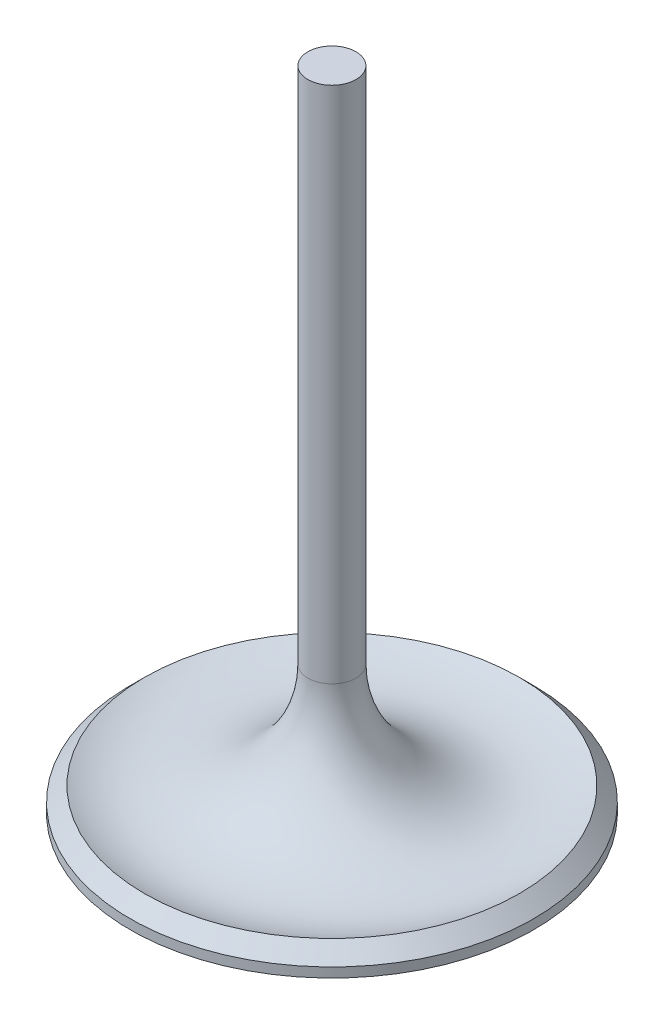
ISO-10303-21;
HEADER;
FILE_DESCRIPTION(('STEP AP214'),'2;1');
FILE_NAME('part.step','',(''),(''),'','','');
FILE_SCHEMA(('AUTOMOTIVE_DESIGN { 1 0 10303 214 1 1 1 1 }'));
ENDSEC;
DATA;
#1=APPLICATION_CONTEXT('core data for automotive mechanical design processes');
#2=APPLICATION_PROTOCOL_DEFINITION('international standard','automotive_design',2000,#1);
#3=PRODUCT_CONTEXT('',#1,'mechanical');
#4=PRODUCT('Part','Part','',(#3));
#5=PRODUCT_RELATED_PRODUCT_CATEGORY('part','',(#4));
#6=PRODUCT_DEFINITION_FORMATION('','',#4);
#7=PRODUCT_DEFINITION_CONTEXT('part definition',#1,'design');
#8=PRODUCT_DEFINITION('design','',#6,#7);
#9=PRODUCT_DEFINITION_SHAPE('','',#8);
#10=(LENGTH_UNIT() NAMED_UNIT(*) SI_UNIT(.MILLI.,.METRE.));
#11=(NAMED_UNIT(*) PLANE_ANGLE_UNIT() SI_UNIT($,.RADIAN.));
#12=(NAMED_UNIT(*) SI_UNIT($,.STERADIAN.) SOLID_ANGLE_UNIT());
#13=UNCERTAINTY_MEASURE_WITH_UNIT(LENGTH_MEASURE(1.E-05),#10,'distance_accuracy_value','');
#14=(GEOMETRIC_REPRESENTATION_CONTEXT(3) GLOBAL_UNCERTAINTY_ASSIGNED_CONTEXT((#13)) GLOBAL_UNIT_ASSIGNED_CONTEXT((#10,
#11,#12)) REPRESENTATION_CONTEXT('',''));
#15=CARTESIAN_POINT('',(0.,0.,0.));
#16=DIRECTION('',(0.,0.,1.));
#17=DIRECTION('',(1.,0.,0.));
#18=AXIS2_PLACEMENT_3D('',#15,#16,#17);
#19=CARTESIAN_POINT('',(26.67,0.,0.));
#20=DIRECTION('',(0.,-1.,0.));
#21=DIRECTION('',(0.,0.,-1.));
#22=AXIS2_PLACEMENT_3D('',#19,#20,#21);
#23=PLANE('',#22);
#24=CARTESIAN_POINT('',(0.,0.,0.));
#25=DIRECTION('',(0.,-1.,0.));
#26=DIRECTION('',(0.,0.,-1.));
#27=AXIS2_PLACEMENT_3D('',#24,#25,#26);
#28=CIRCLE('',#27,26.67);
#29=CARTESIAN_POINT('',(0.,0.,-26.67));
#30=VERTEX_POINT('',#29);
#31=EDGE_CURVE('E10',#30,#30,#28,.T.);
#32=ORIENTED_EDGE('',*,*,#31,.T.);
#33=EDGE_LOOP('',(#32));
#34=FACE_BOUND('',#33,.T.);
#35=ADVANCED_FACE('F41',(#34),#23,.T.);
#36=CARTESIAN_POINT('',(0.,0.,0.));
#37=DIRECTION('',(0.,-1.,0.));
#38=DIRECTION('',(0.,0.,-1.));
#39=AXIS2_PLACEMENT_3D('',#36,#37,#38);
#40=CYLINDRICAL_SURFACE('',#39,26.67);
#41=CARTESIAN_POINT('',(0.,1.27,0.));
#42=DIRECTION('',(0.,-1.,0.));
#43=DIRECTION('',(0.,0.,-1.));
#44=AXIS2_PLACEMENT_3D('',#41,#42,#43);
#45=CIRCLE('',#44,26.67);
#46=CARTESIAN_POINT('',(0.,1.27,-26.67));
#47=VERTEX_POINT('',#46);
#48=EDGE_CURVE('E48',#47,#47,#45,.T.);
#49=ORIENTED_EDGE('',*,*,#48,.T.);
#50=EDGE_LOOP('',(#49));
#51=FACE_BOUND('',#50,.T.);
#52=ORIENTED_EDGE('',*,*,#31,.F.);
#53=EDGE_LOOP('',(#52));
#54=FACE_BOUND('',#53,.T.);
#55=ADVANCED_FACE('F81',(#51,#54),#40,.T.);
#56=CARTESIAN_POINT('',(0.,1.27,0.));
#57=DIRECTION('',(0.,-1.,0.));
#58=DIRECTION('',(0.,0.,-1.));
#59=AXIS2_PLACEMENT_3D('',#56,#57,#58);
#60=CONICAL_SURFACE('',#59,26.67,0.785398163397458);
#61=CARTESIAN_POINT('',(0.,3.17999999999999,0.));
#62=DIRECTION('',(0.,-1.,0.));
#63=DIRECTION('',(0.,0.,-1.));
#64=AXIS2_PLACEMENT_3D('',#61,#62,#63);
#65=CIRCLE('',#64,24.76);
#66=CARTESIAN_POINT('',(0.,3.17999999999999,-24.76));
#67=VERTEX_POINT('',#66);
#68=EDGE_CURVE('E53',#67,#67,#65,.T.);
#69=ORIENTED_EDGE('',*,*,#68,.T.);
#70=EDGE_LOOP('',(#69));
#71=FACE_BOUND('',#70,.T.);
#72=ORIENTED_EDGE('',*,*,#48,.F.);
#73=EDGE_LOOP('',(#72));
#74=FACE_BOUND('',#73,.T.);
#75=ADVANCED_FACE('F85',(#71,#74),#60,.T.);
#76=CARTESIAN_POINT('',(0.,17.0542062836041,0.));
#77=DIRECTION('',(0.,-1.,0.));
#78=DIRECTION('',(0.,0.,-1.));
#79=AXIS2_PLACEMENT_3D('',#76,#77,#78);
#80=TOROIDAL_SURFACE('',#79,18.43,15.25);
#81=CARTESIAN_POINT('',(0.,17.0542062836041,0.));
#82=DIRECTION('',(0.,-1.,0.));
#83=DIRECTION('',(0.,0.,-1.));
#84=AXIS2_PLACEMENT_3D('',#81,#82,#83);
#85=CIRCLE('',#84,3.18000000000001);
#86=CARTESIAN_POINT('',(0.,17.0542062836041,-3.18000000000001));
#87=VERTEX_POINT('',#86);
#88=EDGE_CURVE('E58',#87,#87,#85,.T.);
#89=ORIENTED_EDGE('',*,*,#88,.T.);
#90=EDGE_LOOP('',(#89));
#91=FACE_BOUND('',#90,.T.);
#92=ORIENTED_EDGE('',*,*,#68,.F.);
#93=EDGE_LOOP('',(#92));
#94=FACE_BOUND('',#93,.T.);
#95=ADVANCED_FACE('F78',(#91,#94),#80,.F.);
#96=CARTESIAN_POINT('',(0.,0.,0.));
#97=DIRECTION('',(0.,-1.,0.));
#98=DIRECTION('',(0.,0.,-1.));
#99=AXIS2_PLACEMENT_3D('',#96,#97,#98);
#100=CYLINDRICAL_SURFACE('',#99,3.18000000000001);
#101=CARTESIAN_POINT('',(0.,85.55,0.));
#102=DIRECTION('',(0.,-1.,0.));
#103=DIRECTION('',(0.,0.,-1.));
#104=AXIS2_PLACEMENT_3D('',#101,#102,#103);
#105=CIRCLE('',#104,3.18);
#106=CARTESIAN_POINT('',(0.,85.55,-3.18));
#107=VERTEX_POINT('',#106);
#108=EDGE_CURVE('E64',#107,#107,#105,.T.);
#109=ORIENTED_EDGE('',*,*,#108,.T.);
#110=EDGE_LOOP('',(#109));
#111=FACE_BOUND('',#110,.T.);
#112=ORIENTED_EDGE('',*,*,#88,.F.);
#113=EDGE_LOOP('',(#112));
#114=FACE_BOUND('',#113,.T.);
#115=ADVANCED_FACE('F69',(#111,#114),#100,.T.);
#116=CARTESIAN_POINT('',(0.,85.55,0.));
#117=DIRECTION('',(0.,1.,0.));
#118=DIRECTION('',(0.,0.,1.));
#119=AXIS2_PLACEMENT_3D('',#116,#117,#118);
#120=PLANE('',#119);
#121=ORIENTED_EDGE('',*,*,#108,.F.);
#122=EDGE_LOOP('',(#121));
#123=FACE_BOUND('',#122,.T.);
#124=ADVANCED_FACE('F72',(#123),#120,.T.);
#125=CLOSED_SHELL('',(#35,#55,#75,#95,#115,#124));
#126=MANIFOLD_SOLID_BREP('B2',#125);
#127=ADVANCED_BREP_SHAPE_REPRESENTATION('',(#18,#126),#14);
#128=SHAPE_DEFINITION_REPRESENTATION(#9,#127);
ENDSEC;
END-ISO-10303-21;
